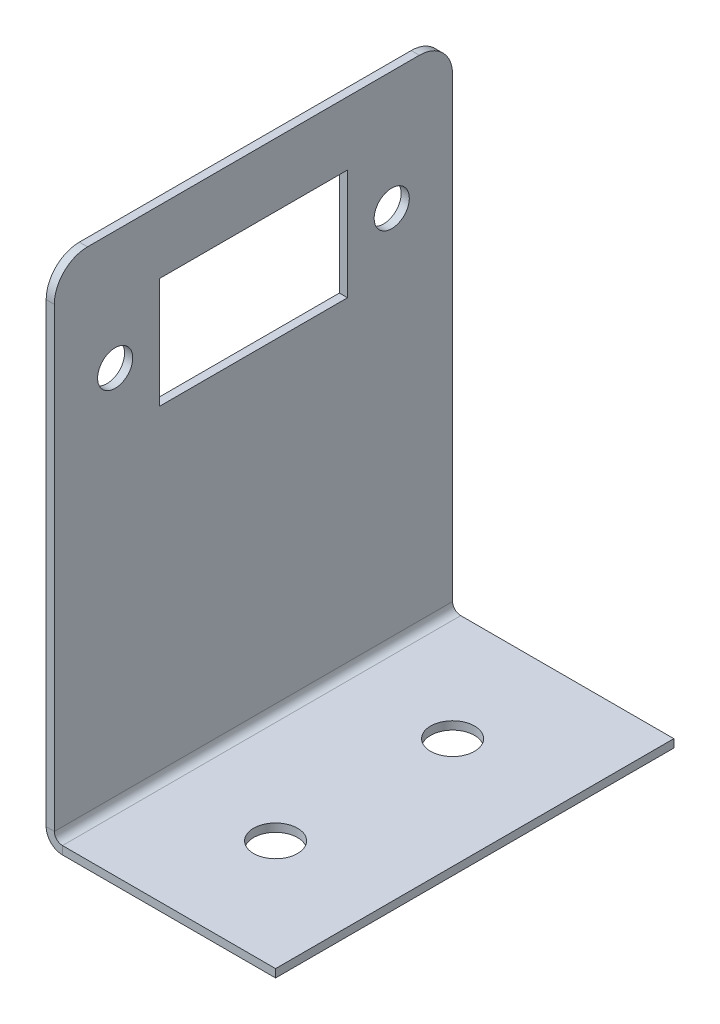
ISO-10303-21;
HEADER;
FILE_DESCRIPTION(('STEP AP214'),'2;1');
FILE_NAME('part.step','',(''),(''),'','','');
FILE_SCHEMA(('AUTOMOTIVE_DESIGN { 1 0 10303 214 1 1 1 1 }'));
ENDSEC;
DATA;
#1=APPLICATION_CONTEXT('core data for automotive mechanical design processes');
#2=APPLICATION_PROTOCOL_DEFINITION('international standard','automotive_design',2000,#1);
#3=PRODUCT_CONTEXT('',#1,'mechanical');
#4=PRODUCT('Part','Part','',(#3));
#5=PRODUCT_RELATED_PRODUCT_CATEGORY('part','',(#4));
#6=PRODUCT_DEFINITION_FORMATION('','',#4);
#7=PRODUCT_DEFINITION_CONTEXT('part definition',#1,'design');
#8=PRODUCT_DEFINITION('design','',#6,#7);
#9=PRODUCT_DEFINITION_SHAPE('','',#8);
#10=(LENGTH_UNIT() NAMED_UNIT(*) SI_UNIT(.MILLI.,.METRE.));
#11=(NAMED_UNIT(*) PLANE_ANGLE_UNIT() SI_UNIT($,.RADIAN.));
#12=(NAMED_UNIT(*) SI_UNIT($,.STERADIAN.) SOLID_ANGLE_UNIT());
#13=UNCERTAINTY_MEASURE_WITH_UNIT(LENGTH_MEASURE(1.E-05),#10,'distance_accuracy_value','');
#14=(GEOMETRIC_REPRESENTATION_CONTEXT(3) GLOBAL_UNCERTAINTY_ASSIGNED_CONTEXT((#13)) GLOBAL_UNIT_ASSIGNED_CONTEXT((#10,
#11,#12)) REPRESENTATION_CONTEXT('',''));
#15=CARTESIAN_POINT('',(0.,0.,0.));
#16=DIRECTION('',(0.,0.,1.));
#17=DIRECTION('',(1.,0.,0.));
#18=AXIS2_PLACEMENT_3D('',#15,#16,#17);
#19=CARTESIAN_POINT('',(0.736600000000004,0.,18.));
#20=DIRECTION('',(0.,0.,1.));
#21=DIRECTION('',(1.,0.,0.));
#22=AXIS2_PLACEMENT_3D('',#19,#20,#21);
#23=PLANE('',#22);
#24=DIRECTION('',(0.,-1.,0.));
#25=VECTOR('',#24,1.);
#26=CARTESIAN_POINT('',(0.736600000000004,0.,18.));
#27=LINE('',#26,#25);
#28=CARTESIAN_POINT('',(0.736600000000004,0.,18.));
#29=VERTEX_POINT('',#28);
#30=CARTESIAN_POINT('',(0.736600000000004,-0.7366,18.));
#31=VERTEX_POINT('',#30);
#32=EDGE_CURVE('E250',#29,#31,#27,.T.);
#33=ORIENTED_EDGE('',*,*,#32,.F.);
#34=CARTESIAN_POINT('',(0.736600000000004,0.736600000000005,18.));
#35=DIRECTION('',(0.,0.,-1.));
#36=DIRECTION('',(-1.,0.,0.));
#37=AXIS2_PLACEMENT_3D('',#34,#35,#36);
#38=CIRCLE('',#37,0.7366);
#39=CARTESIAN_POINT('',(0.,0.736600000000032,18.));
#40=VERTEX_POINT('',#39);
#41=EDGE_CURVE('E195',#40,#29,#38,.F.);
#42=ORIENTED_EDGE('',*,*,#41,.F.);
#43=DIRECTION('',(1.,0.,0.));
#44=VECTOR('',#43,1.);
#45=CARTESIAN_POINT('',(-0.736600000000004,0.736600000000058,18.));
#46=LINE('',#45,#44);
#47=CARTESIAN_POINT('',(-0.736600000000004,0.736600000000058,18.));
#48=VERTEX_POINT('',#47);
#49=EDGE_CURVE('E247',#48,#40,#46,.T.);
#50=ORIENTED_EDGE('',*,*,#49,.F.);
#51=CARTESIAN_POINT('',(0.736600000000004,0.736600000000005,18.));
#52=DIRECTION('',(0.,0.,1.));
#53=DIRECTION('',(1.,0.,0.));
#54=AXIS2_PLACEMENT_3D('',#51,#52,#53);
#55=CIRCLE('',#54,1.4732);
#56=EDGE_CURVE('E202',#48,#31,#55,.T.);
#57=ORIENTED_EDGE('',*,*,#56,.T.);
#58=EDGE_LOOP('',(#33,#42,#50,#57));
#59=FACE_BOUND('',#58,.T.);
#60=ADVANCED_FACE('F36',(#59),#23,.T.);
#61=CARTESIAN_POINT('',(-0.736600000000004,0.736600000000058,18.));
#62=DIRECTION('',(0.,0.,1.));
#63=DIRECTION('',(1.,0.,0.));
#64=AXIS2_PLACEMENT_3D('',#61,#62,#63);
#65=PLANE('',#64);
#66=DIRECTION('',(1.,0.,0.));
#67=VECTOR('',#66,1.);
#68=CARTESIAN_POINT('',(0.,0.,18.));
#69=LINE('',#68,#67);
#70=CARTESIAN_POINT('',(20.,0.,18.));
#71=VERTEX_POINT('',#70);
#72=EDGE_CURVE('E192',#29,#71,#69,.T.);
#73=ORIENTED_EDGE('',*,*,#72,.F.);
#74=ORIENTED_EDGE('',*,*,#32,.T.);
#75=DIRECTION('',(1.,0.,0.));
#76=VECTOR('',#75,1.);
#77=CARTESIAN_POINT('',(0.,-0.7366,18.));
#78=LINE('',#77,#76);
#79=CARTESIAN_POINT('',(20.,-0.7366,18.));
#80=VERTEX_POINT('',#79);
#81=EDGE_CURVE('E186',#31,#80,#78,.T.);
#82=ORIENTED_EDGE('',*,*,#81,.T.);
#83=DIRECTION('',(0.,-1.,0.));
#84=VECTOR('',#83,1.);
#85=CARTESIAN_POINT('',(20.,0.,18.));
#86=LINE('',#85,#84);
#87=EDGE_CURVE('E188',#71,#80,#86,.T.);
#88=ORIENTED_EDGE('',*,*,#87,.F.);
#89=EDGE_LOOP('',(#73,#74,#82,#88));
#90=FACE_BOUND('',#89,.T.);
#91=ADVANCED_FACE('F298',(#90),#65,.T.);
#92=CARTESIAN_POINT('',(0.,0.736600000000032,-18.));
#93=DIRECTION('',(0.,0.,-1.));
#94=DIRECTION('',(-1.,0.,0.));
#95=AXIS2_PLACEMENT_3D('',#92,#93,#94);
#96=PLANE('',#95);
#97=DIRECTION('',(-1.,0.,0.));
#98=VECTOR('',#97,1.);
#99=CARTESIAN_POINT('',(0.,0.736600000000032,-18.));
#100=LINE('',#99,#98);
#101=CARTESIAN_POINT('',(0.,0.736600000000032,-18.));
#102=VERTEX_POINT('',#101);
#103=CARTESIAN_POINT('',(-0.736600000000004,0.736600000000058,-18.));
#104=VERTEX_POINT('',#103);
#105=EDGE_CURVE('E244',#102,#104,#100,.T.);
#106=ORIENTED_EDGE('',*,*,#105,.F.);
#107=CARTESIAN_POINT('',(0.736600000000004,0.736600000000005,-18.));
#108=DIRECTION('',(0.,0.,-1.));
#109=DIRECTION('',(-1.,0.,0.));
#110=AXIS2_PLACEMENT_3D('',#107,#108,#109);
#111=CIRCLE('',#110,0.7366);
#112=CARTESIAN_POINT('',(0.736600000000004,0.,-18.));
#113=VERTEX_POINT('',#112);
#114=EDGE_CURVE('E214',#102,#113,#111,.F.);
#115=ORIENTED_EDGE('',*,*,#114,.T.);
#116=DIRECTION('',(0.,1.,0.));
#117=VECTOR('',#116,1.);
#118=CARTESIAN_POINT('',(0.736600000000004,-0.7366,-18.));
#119=LINE('',#118,#117);
#120=CARTESIAN_POINT('',(0.736600000000004,-0.7366,-18.));
#121=VERTEX_POINT('',#120);
#122=EDGE_CURVE('E242',#121,#113,#119,.T.);
#123=ORIENTED_EDGE('',*,*,#122,.F.);
#124=CARTESIAN_POINT('',(0.736600000000004,0.736600000000005,-18.));
#125=DIRECTION('',(0.,0.,1.));
#126=DIRECTION('',(1.,0.,0.));
#127=AXIS2_PLACEMENT_3D('',#124,#125,#126);
#128=CIRCLE('',#127,1.4732);
#129=EDGE_CURVE('E189',#104,#121,#128,.T.);
#130=ORIENTED_EDGE('',*,*,#129,.F.);
#131=EDGE_LOOP('',(#106,#115,#123,#130));
#132=FACE_BOUND('',#131,.T.);
#133=ADVANCED_FACE('F309',(#132),#96,.T.);
#134=CARTESIAN_POINT('',(0.736600000000004,-0.7366,-18.));
#135=DIRECTION('',(0.,0.,-1.));
#136=DIRECTION('',(-1.,0.,0.));
#137=AXIS2_PLACEMENT_3D('',#134,#135,#136);
#138=PLANE('',#137);
#139=DIRECTION('',(0.,-1.,0.));
#140=VECTOR('',#139,1.);
#141=CARTESIAN_POINT('',(-0.73659999999999,45.,-18.));
#142=LINE('',#141,#140);
#143=CARTESIAN_POINT('',(-0.73659999999999,42.,-18.));
#144=VERTEX_POINT('',#143);
#145=EDGE_CURVE('E219',#144,#104,#142,.T.);
#146=ORIENTED_EDGE('',*,*,#145,.F.);
#147=DIRECTION('',(1.,0.,0.));
#148=VECTOR('',#147,1.);
#149=CARTESIAN_POINT('',(0.736600000000004,42.,-18.));
#150=LINE('',#149,#148);
#151=CARTESIAN_POINT('',(0.,42.,-18.));
#152=VERTEX_POINT('',#151);
#153=EDGE_CURVE('E252',#144,#152,#150,.T.);
#154=ORIENTED_EDGE('',*,*,#153,.T.);
#155=DIRECTION('',(0.,-1.,0.));
#156=VECTOR('',#155,1.);
#157=CARTESIAN_POINT('',(0.,45.,-18.));
#158=LINE('',#157,#156);
#159=EDGE_CURVE('E217',#152,#102,#158,.T.);
#160=ORIENTED_EDGE('',*,*,#159,.T.);
#161=ORIENTED_EDGE('',*,*,#105,.T.);
#162=EDGE_LOOP('',(#146,#154,#160,#161));
#163=FACE_BOUND('',#162,.T.);
#164=ADVANCED_FACE('F270',(#163),#138,.T.);
#165=CARTESIAN_POINT('',(0.,-0.7366,18.));
#166=DIRECTION('',(0.,1.,0.));
#167=DIRECTION('',(0.,0.,1.));
#168=AXIS2_PLACEMENT_3D('',#165,#166,#167);
#169=PLANE('',#168);
#170=CARTESIAN_POINT('',(9.99999999999999,-0.7366,8.));
#171=DIRECTION('',(0.,1.,0.));
#172=DIRECTION('',(0.,0.,1.));
#173=AXIS2_PLACEMENT_3D('',#170,#171,#172);
#174=CIRCLE('',#173,1.984375);
#175=CARTESIAN_POINT('',(9.99999999999999,-0.7366,9.984375));
#176=VERTEX_POINT('',#175);
#177=EDGE_CURVE('E398',#176,#176,#174,.T.);
#178=ORIENTED_EDGE('',*,*,#177,.T.);
#179=EDGE_LOOP('',(#178));
#180=FACE_BOUND('',#179,.T.);
#181=CARTESIAN_POINT('',(9.99999999999999,-0.7366,-8.));
#182=DIRECTION('',(0.,1.,0.));
#183=DIRECTION('',(0.,0.,1.));
#184=AXIS2_PLACEMENT_3D('',#181,#182,#183);
#185=CIRCLE('',#184,1.984375);
#186=CARTESIAN_POINT('',(9.99999999999999,-0.7366,-6.015625));
#187=VERTEX_POINT('',#186);
#188=EDGE_CURVE('E397',#187,#187,#185,.T.);
#189=ORIENTED_EDGE('',*,*,#188,.T.);
#190=EDGE_LOOP('',(#189));
#191=FACE_BOUND('',#190,.T.);
#192=DIRECTION('',(1.,0.,0.));
#193=VECTOR('',#192,1.);
#194=CARTESIAN_POINT('',(0.,-0.7366,-18.));
#195=LINE('',#194,#193);
#196=CARTESIAN_POINT('',(20.,-0.7366,-18.));
#197=VERTEX_POINT('',#196);
#198=EDGE_CURVE('E182',#121,#197,#195,.T.);
#199=ORIENTED_EDGE('',*,*,#198,.T.);
#200=DIRECTION('',(0.,0.,-1.));
#201=VECTOR('',#200,1.);
#202=CARTESIAN_POINT('',(20.,-0.7366,18.));
#203=LINE('',#202,#201);
#204=EDGE_CURVE('E240',#80,#197,#203,.T.);
#205=ORIENTED_EDGE('',*,*,#204,.F.);
#206=ORIENTED_EDGE('',*,*,#81,.F.);
#207=DIRECTION('',(0.,0.,-1.));
#208=VECTOR('',#207,1.);
#209=CARTESIAN_POINT('',(0.736600000000004,-0.7366,18.));
#210=LINE('',#209,#208);
#211=EDGE_CURVE('E205',#31,#121,#210,.T.);
#212=ORIENTED_EDGE('',*,*,#211,.T.);
#213=EDGE_LOOP('',(#199,#205,#206,#212));
#214=FACE_BOUND('',#213,.T.);
#215=ADVANCED_FACE('F313',(#180,#191,#214),#169,.F.);
#216=CARTESIAN_POINT('',(20.,0.,18.));
#217=DIRECTION('',(1.,0.,0.));
#218=DIRECTION('',(0.,0.,-1.));
#219=AXIS2_PLACEMENT_3D('',#216,#217,#218);
#220=PLANE('',#219);
#221=DIRECTION('',(0.,-1.,0.));
#222=VECTOR('',#221,1.);
#223=CARTESIAN_POINT('',(20.,0.,-18.));
#224=LINE('',#223,#222);
#225=CARTESIAN_POINT('',(20.,0.,-18.));
#226=VERTEX_POINT('',#225);
#227=EDGE_CURVE('E208',#226,#197,#224,.T.);
#228=ORIENTED_EDGE('',*,*,#227,.F.);
#229=DIRECTION('',(0.,0.,-1.));
#230=VECTOR('',#229,1.);
#231=CARTESIAN_POINT('',(20.,0.,18.));
#232=LINE('',#231,#230);
#233=EDGE_CURVE('E238',#71,#226,#232,.T.);
#234=ORIENTED_EDGE('',*,*,#233,.F.);
#235=ORIENTED_EDGE('',*,*,#87,.T.);
#236=ORIENTED_EDGE('',*,*,#204,.T.);
#237=EDGE_LOOP('',(#228,#234,#235,#236));
#238=FACE_BOUND('',#237,.T.);
#239=ADVANCED_FACE('F303',(#238),#220,.T.);
#240=CARTESIAN_POINT('',(0.,0.,18.));
#241=DIRECTION('',(0.,1.,0.));
#242=DIRECTION('',(0.,0.,1.));
#243=AXIS2_PLACEMENT_3D('',#240,#241,#242);
#244=PLANE('',#243);
#245=CARTESIAN_POINT('',(9.99999999999999,0.,8.));
#246=DIRECTION('',(0.,1.,0.));
#247=DIRECTION('',(0.,0.,1.));
#248=AXIS2_PLACEMENT_3D('',#245,#246,#247);
#249=CIRCLE('',#248,1.984375);
#250=CARTESIAN_POINT('',(9.99999999999999,0.,9.984375));
#251=VERTEX_POINT('',#250);
#252=EDGE_CURVE('E392',#251,#251,#249,.T.);
#253=ORIENTED_EDGE('',*,*,#252,.F.);
#254=EDGE_LOOP('',(#253));
#255=FACE_BOUND('',#254,.T.);
#256=CARTESIAN_POINT('',(9.99999999999999,0.,-8.));
#257=DIRECTION('',(0.,1.,0.));
#258=DIRECTION('',(0.,0.,1.));
#259=AXIS2_PLACEMENT_3D('',#256,#257,#258);
#260=CIRCLE('',#259,1.984375);
#261=CARTESIAN_POINT('',(9.99999999999999,0.,-6.015625));
#262=VERTEX_POINT('',#261);
#263=EDGE_CURVE('E395',#262,#262,#260,.T.);
#264=ORIENTED_EDGE('',*,*,#263,.F.);
#265=EDGE_LOOP('',(#264));
#266=FACE_BOUND('',#265,.T.);
#267=DIRECTION('',(1.,0.,0.));
#268=VECTOR('',#267,1.);
#269=CARTESIAN_POINT('',(0.,0.,-18.));
#270=LINE('',#269,#268);
#271=EDGE_CURVE('E211',#113,#226,#270,.T.);
#272=ORIENTED_EDGE('',*,*,#271,.F.);
#273=DIRECTION('',(0.,0.,-1.));
#274=VECTOR('',#273,1.);
#275=CARTESIAN_POINT('',(0.736600000000004,0.,18.));
#276=LINE('',#275,#274);
#277=EDGE_CURVE('E235',#29,#113,#276,.T.);
#278=ORIENTED_EDGE('',*,*,#277,.F.);
#279=ORIENTED_EDGE('',*,*,#72,.T.);
#280=ORIENTED_EDGE('',*,*,#233,.T.);
#281=EDGE_LOOP('',(#272,#278,#279,#280));
#282=FACE_BOUND('',#281,.T.);
#283=ADVANCED_FACE('F296',(#255,#266,#282),#244,.T.);
#284=CARTESIAN_POINT('',(0.736600000000004,0.736600000000005,18.));
#285=DIRECTION('',(0.,0.,-1.));
#286=DIRECTION('',(-1.,0.,0.));
#287=AXIS2_PLACEMENT_3D('',#284,#285,#286);
#288=CYLINDRICAL_SURFACE('',#287,0.7366);
#289=ORIENTED_EDGE('',*,*,#114,.F.);
#290=DIRECTION('',(0.,0.,-1.));
#291=VECTOR('',#290,1.);
#292=CARTESIAN_POINT('',(0.,0.736600000000032,18.));
#293=LINE('',#292,#291);
#294=EDGE_CURVE('E232',#40,#102,#293,.T.);
#295=ORIENTED_EDGE('',*,*,#294,.F.);
#296=ORIENTED_EDGE('',*,*,#41,.T.);
#297=ORIENTED_EDGE('',*,*,#277,.T.);
#298=EDGE_LOOP('',(#289,#295,#296,#297));
#299=FACE_BOUND('',#298,.T.);
#300=ADVANCED_FACE('F288',(#299),#288,.F.);
#301=CARTESIAN_POINT('',(0.,45.,18.));
#302=DIRECTION('',(1.,0.,0.));
#303=DIRECTION('',(0.,1.,0.));
#304=AXIS2_PLACEMENT_3D('',#301,#302,#303);
#305=PLANE('',#304);
#306=CARTESIAN_POINT('',(0.,34.2634,-12.5));
#307=DIRECTION('',(1.,0.,0.));
#308=DIRECTION('',(0.,1.,0.));
#309=AXIS2_PLACEMENT_3D('',#306,#307,#308);
#310=CIRCLE('',#309,1.5875);
#311=CARTESIAN_POINT('',(0.,35.8509,-12.5));
#312=VERTEX_POINT('',#311);
#313=EDGE_CURVE('E401',#312,#312,#310,.T.);
#314=ORIENTED_EDGE('',*,*,#313,.F.);
#315=EDGE_LOOP('',(#314));
#316=FACE_BOUND('',#315,.T.);
#317=CARTESIAN_POINT('',(0.,34.2634,12.5));
#318=DIRECTION('',(1.,0.,0.));
#319=DIRECTION('',(0.,1.,0.));
#320=AXIS2_PLACEMENT_3D('',#317,#318,#319);
#321=CIRCLE('',#320,1.5875);
#322=CARTESIAN_POINT('',(0.,35.8509,12.5));
#323=VERTEX_POINT('',#322);
#324=EDGE_CURVE('E169',#323,#323,#321,.T.);
#325=ORIENTED_EDGE('',*,*,#324,.F.);
#326=EDGE_LOOP('',(#325));
#327=FACE_BOUND('',#326,.T.);
#328=DIRECTION('',(0.,-1.,0.));
#329=VECTOR('',#328,1.);
#330=CARTESIAN_POINT('',(0.,39.2634,8.5));
#331=LINE('',#330,#329);
#332=CARTESIAN_POINT('',(0.,39.2634,8.5));
#333=VERTEX_POINT('',#332);
#334=CARTESIAN_POINT('',(0.,29.2634,8.5));
#335=VERTEX_POINT('',#334);
#336=EDGE_CURVE('E145',#333,#335,#331,.T.);
#337=ORIENTED_EDGE('',*,*,#336,.F.);
#338=DIRECTION('',(0.,0.,1.));
#339=VECTOR('',#338,1.);
#340=CARTESIAN_POINT('',(0.,39.2634,8.5));
#341=LINE('',#340,#339);
#342=CARTESIAN_POINT('',(0.,39.2634,-8.5));
#343=VERTEX_POINT('',#342);
#344=EDGE_CURVE('E163',#343,#333,#341,.T.);
#345=ORIENTED_EDGE('',*,*,#344,.F.);
#346=DIRECTION('',(0.,1.,0.));
#347=VECTOR('',#346,1.);
#348=CARTESIAN_POINT('',(0.,39.2634,-8.5));
#349=LINE('',#348,#347);
#350=CARTESIAN_POINT('',(0.,29.2634,-8.5));
#351=VERTEX_POINT('',#350);
#352=EDGE_CURVE('E166',#351,#343,#349,.T.);
#353=ORIENTED_EDGE('',*,*,#352,.F.);
#354=DIRECTION('',(0.,0.,-1.));
#355=VECTOR('',#354,1.);
#356=CARTESIAN_POINT('',(0.,29.2634,8.5));
#357=LINE('',#356,#355);
#358=EDGE_CURVE('E175',#335,#351,#357,.T.);
#359=ORIENTED_EDGE('',*,*,#358,.F.);
#360=EDGE_LOOP('',(#337,#345,#353,#359));
#361=FACE_BOUND('',#360,.T.);
#362=ORIENTED_EDGE('',*,*,#159,.F.);
#363=CARTESIAN_POINT('',(0.,42.,-15.));
#364=DIRECTION('',(1.,0.,0.));
#365=DIRECTION('',(0.,1.,0.));
#366=AXIS2_PLACEMENT_3D('',#363,#364,#365);
#367=CIRCLE('',#366,3.);
#368=CARTESIAN_POINT('',(0.,45.,-15.));
#369=VERTEX_POINT('',#368);
#370=EDGE_CURVE('E257',#152,#369,#367,.T.);
#371=ORIENTED_EDGE('',*,*,#370,.T.);
#372=DIRECTION('',(0.,0.,-1.));
#373=VECTOR('',#372,1.);
#374=CARTESIAN_POINT('',(0.,45.,18.));
#375=LINE('',#374,#373);
#376=CARTESIAN_POINT('',(0.,45.,15.));
#377=VERTEX_POINT('',#376);
#378=EDGE_CURVE('E230',#377,#369,#375,.T.);
#379=ORIENTED_EDGE('',*,*,#378,.F.);
#380=CARTESIAN_POINT('',(0.,42.,15.));
#381=DIRECTION('',(1.,0.,0.));
#382=DIRECTION('',(0.,1.,0.));
#383=AXIS2_PLACEMENT_3D('',#380,#381,#382);
#384=CIRCLE('',#383,3.);
#385=CARTESIAN_POINT('',(0.,42.,18.));
#386=VERTEX_POINT('',#385);
#387=EDGE_CURVE('E255',#377,#386,#384,.T.);
#388=ORIENTED_EDGE('',*,*,#387,.T.);
#389=DIRECTION('',(0.,-1.,0.));
#390=VECTOR('',#389,1.);
#391=CARTESIAN_POINT('',(0.,45.,18.));
#392=LINE('',#391,#390);
#393=EDGE_CURVE('E198',#386,#40,#392,.T.);
#394=ORIENTED_EDGE('',*,*,#393,.T.);
#395=ORIENTED_EDGE('',*,*,#294,.T.);
#396=EDGE_LOOP('',(#362,#371,#379,#388,#394,#395));
#397=FACE_BOUND('',#396,.T.);
#398=ADVANCED_FACE('F276',(#316,#327,#361,#397),#305,.T.);
#399=CARTESIAN_POINT('',(-0.73659999999999,45.,18.));
#400=DIRECTION('',(0.,1.,0.));
#401=DIRECTION('',(0.,0.,1.));
#402=AXIS2_PLACEMENT_3D('',#399,#400,#401);
#403=PLANE('',#402);
#404=ORIENTED_EDGE('',*,*,#378,.T.);
#405=DIRECTION('',(1.,0.,0.));
#406=VECTOR('',#405,1.);
#407=CARTESIAN_POINT('',(-0.73659999999999,45.,-15.));
#408=LINE('',#407,#406);
#409=CARTESIAN_POINT('',(-0.73659999999999,45.,-15.));
#410=VERTEX_POINT('',#409);
#411=EDGE_CURVE('E57',#369,#410,#408,.F.);
#412=ORIENTED_EDGE('',*,*,#411,.T.);
#413=DIRECTION('',(0.,0.,-1.));
#414=VECTOR('',#413,1.);
#415=CARTESIAN_POINT('',(-0.73659999999999,45.,18.));
#416=LINE('',#415,#414);
#417=CARTESIAN_POINT('',(-0.73659999999999,45.,15.));
#418=VERTEX_POINT('',#417);
#419=EDGE_CURVE('E228',#418,#410,#416,.T.);
#420=ORIENTED_EDGE('',*,*,#419,.F.);
#421=DIRECTION('',(1.,0.,0.));
#422=VECTOR('',#421,1.);
#423=CARTESIAN_POINT('',(0.,45.,15.));
#424=LINE('',#423,#422);
#425=EDGE_CURVE('E259',#418,#377,#424,.T.);
#426=ORIENTED_EDGE('',*,*,#425,.T.);
#427=EDGE_LOOP('',(#404,#412,#420,#426));
#428=FACE_BOUND('',#427,.T.);
#429=ADVANCED_FACE('F277',(#428),#403,.T.);
#430=CARTESIAN_POINT('',(-0.73659999999999,45.,18.));
#431=DIRECTION('',(1.,0.,0.));
#432=DIRECTION('',(0.,1.,0.));
#433=AXIS2_PLACEMENT_3D('',#430,#431,#432);
#434=PLANE('',#433);
#435=CARTESIAN_POINT('',(-0.736600000000004,34.2634,-12.5));
#436=DIRECTION('',(1.,0.,0.));
#437=DIRECTION('',(0.,1.,0.));
#438=AXIS2_PLACEMENT_3D('',#435,#436,#437);
#439=CIRCLE('',#438,1.5875);
#440=CARTESIAN_POINT('',(-0.736600000000003,35.8509,-12.5));
#441=VERTEX_POINT('',#440);
#442=EDGE_CURVE('E406',#441,#441,#439,.T.);
#443=ORIENTED_EDGE('',*,*,#442,.T.);
#444=EDGE_LOOP('',(#443));
#445=FACE_BOUND('',#444,.T.);
#446=CARTESIAN_POINT('',(-0.736600000000004,34.2634,12.5));
#447=DIRECTION('',(1.,0.,0.));
#448=DIRECTION('',(0.,1.,0.));
#449=AXIS2_PLACEMENT_3D('',#446,#447,#448);
#450=CIRCLE('',#449,1.5875);
#451=CARTESIAN_POINT('',(-0.736600000000003,35.8509,12.5));
#452=VERTEX_POINT('',#451);
#453=EDGE_CURVE('E176',#452,#452,#450,.T.);
#454=ORIENTED_EDGE('',*,*,#453,.T.);
#455=EDGE_LOOP('',(#454));
#456=FACE_BOUND('',#455,.T.);
#457=DIRECTION('',(0.,0.,1.));
#458=VECTOR('',#457,1.);
#459=CARTESIAN_POINT('',(-0.736600000000004,39.2634,8.5));
#460=LINE('',#459,#458);
#461=CARTESIAN_POINT('',(-0.736600000000004,39.2634,-8.5));
#462=VERTEX_POINT('',#461);
#463=CARTESIAN_POINT('',(-0.736600000000004,39.2634,8.5));
#464=VERTEX_POINT('',#463);
#465=EDGE_CURVE('E150',#462,#464,#460,.T.);
#466=ORIENTED_EDGE('',*,*,#465,.T.);
#467=DIRECTION('',(0.,-1.,0.));
#468=VECTOR('',#467,1.);
#469=CARTESIAN_POINT('',(-0.736600000000004,39.2634,8.5));
#470=LINE('',#469,#468);
#471=CARTESIAN_POINT('',(-0.736600000000004,29.2634,8.5));
#472=VERTEX_POINT('',#471);
#473=EDGE_CURVE('E142',#464,#472,#470,.T.);
#474=ORIENTED_EDGE('',*,*,#473,.T.);
#475=DIRECTION('',(0.,0.,-1.));
#476=VECTOR('',#475,1.);
#477=CARTESIAN_POINT('',(-0.736600000000004,29.2634,8.5));
#478=LINE('',#477,#476);
#479=CARTESIAN_POINT('',(-0.73659999999999,29.2634,-8.5));
#480=VERTEX_POINT('',#479);
#481=EDGE_CURVE('E154',#472,#480,#478,.T.);
#482=ORIENTED_EDGE('',*,*,#481,.T.);
#483=DIRECTION('',(0.,1.,0.));
#484=VECTOR('',#483,1.);
#485=CARTESIAN_POINT('',(-0.736600000000004,39.2634,-8.5));
#486=LINE('',#485,#484);
#487=EDGE_CURVE('E158',#480,#462,#486,.T.);
#488=ORIENTED_EDGE('',*,*,#487,.T.);
#489=EDGE_LOOP('',(#466,#474,#482,#488));
#490=FACE_BOUND('',#489,.T.);
#491=ORIENTED_EDGE('',*,*,#419,.T.);
#492=CARTESIAN_POINT('',(-0.73659999999999,42.,-15.));
#493=DIRECTION('',(1.,0.,0.));
#494=DIRECTION('',(0.,1.,0.));
#495=AXIS2_PLACEMENT_3D('',#492,#493,#494);
#496=CIRCLE('',#495,3.);
#497=EDGE_CURVE('E44',#410,#144,#496,.F.);
#498=ORIENTED_EDGE('',*,*,#497,.T.);
#499=ORIENTED_EDGE('',*,*,#145,.T.);
#500=DIRECTION('',(0.,0.,-1.));
#501=VECTOR('',#500,1.);
#502=CARTESIAN_POINT('',(-0.736600000000004,0.736600000000058,18.));
#503=LINE('',#502,#501);
#504=EDGE_CURVE('E225',#48,#104,#503,.T.);
#505=ORIENTED_EDGE('',*,*,#504,.F.);
#506=DIRECTION('',(0.,-1.,0.));
#507=VECTOR('',#506,1.);
#508=CARTESIAN_POINT('',(-0.73659999999999,45.,18.));
#509=LINE('',#508,#507);
#510=CARTESIAN_POINT('',(-0.73659999999999,42.,18.));
#511=VERTEX_POINT('',#510);
#512=EDGE_CURVE('E200',#511,#48,#509,.T.);
#513=ORIENTED_EDGE('',*,*,#512,.F.);
#514=CARTESIAN_POINT('',(-0.73659999999999,42.,15.));
#515=DIRECTION('',(1.,0.,0.));
#516=DIRECTION('',(0.,1.,0.));
#517=AXIS2_PLACEMENT_3D('',#514,#515,#516);
#518=CIRCLE('',#517,3.);
#519=EDGE_CURVE('E263',#511,#418,#518,.F.);
#520=ORIENTED_EDGE('',*,*,#519,.T.);
#521=EDGE_LOOP('',(#491,#498,#499,#505,#513,#520));
#522=FACE_BOUND('',#521,.T.);
#523=ADVANCED_FACE('F160',(#445,#456,#490,#522),#434,.F.);
#524=CARTESIAN_POINT('',(0.736600000000004,0.736600000000005,18.));
#525=DIRECTION('',(0.,0.,-1.));
#526=DIRECTION('',(-1.,0.,0.));
#527=AXIS2_PLACEMENT_3D('',#524,#525,#526);
#528=CYLINDRICAL_SURFACE('',#527,1.4732);
#529=ORIENTED_EDGE('',*,*,#129,.T.);
#530=ORIENTED_EDGE('',*,*,#211,.F.);
#531=ORIENTED_EDGE('',*,*,#56,.F.);
#532=ORIENTED_EDGE('',*,*,#504,.T.);
#533=EDGE_LOOP('',(#529,#530,#531,#532));
#534=FACE_BOUND('',#533,.T.);
#535=ADVANCED_FACE('F311',(#534),#528,.T.);
#536=CARTESIAN_POINT('',(0.736600000000004,0.736600000000005,18.));
#537=DIRECTION('',(0.,0.,-1.));
#538=DIRECTION('',(-1.,0.,0.));
#539=AXIS2_PLACEMENT_3D('',#536,#537,#538);
#540=PLANE('',#539);
#541=ORIENTED_EDGE('',*,*,#393,.F.);
#542=DIRECTION('',(1.,0.,0.));
#543=VECTOR('',#542,1.);
#544=CARTESIAN_POINT('',(-0.73659999999999,42.,18.));
#545=LINE('',#544,#543);
#546=EDGE_CURVE('E11',#386,#511,#545,.F.);
#547=ORIENTED_EDGE('',*,*,#546,.T.);
#548=ORIENTED_EDGE('',*,*,#512,.T.);
#549=ORIENTED_EDGE('',*,*,#49,.T.);
#550=EDGE_LOOP('',(#541,#547,#548,#549));
#551=FACE_BOUND('',#550,.T.);
#552=ADVANCED_FACE('F281',(#551),#540,.F.);
#553=CARTESIAN_POINT('',(0.736600000000004,0.736600000000005,-18.));
#554=DIRECTION('',(0.,0.,-1.));
#555=DIRECTION('',(-1.,0.,0.));
#556=AXIS2_PLACEMENT_3D('',#553,#554,#555);
#557=PLANE('',#556);
#558=ORIENTED_EDGE('',*,*,#198,.F.);
#559=ORIENTED_EDGE('',*,*,#122,.T.);
#560=ORIENTED_EDGE('',*,*,#271,.T.);
#561=ORIENTED_EDGE('',*,*,#227,.T.);
#562=EDGE_LOOP('',(#558,#559,#560,#561));
#563=FACE_BOUND('',#562,.T.);
#564=ADVANCED_FACE('F306',(#563),#557,.T.);
#565=CARTESIAN_POINT('',(-0.736600000000004,39.2634,8.5));
#566=DIRECTION('',(0.,0.,1.));
#567=DIRECTION('',(0.,-1.,0.));
#568=AXIS2_PLACEMENT_3D('',#565,#566,#567);
#569=PLANE('',#568);
#570=ORIENTED_EDGE('',*,*,#336,.T.);
#571=DIRECTION('',(1.,0.,0.));
#572=VECTOR('',#571,1.);
#573=CARTESIAN_POINT('',(-0.736600000000004,29.2634,8.5));
#574=LINE('',#573,#572);
#575=EDGE_CURVE('E138',#472,#335,#574,.T.);
#576=ORIENTED_EDGE('',*,*,#575,.F.);
#577=ORIENTED_EDGE('',*,*,#473,.F.);
#578=DIRECTION('',(1.,0.,0.));
#579=VECTOR('',#578,1.);
#580=CARTESIAN_POINT('',(-0.736600000000004,39.2634,8.5));
#581=LINE('',#580,#579);
#582=EDGE_CURVE('E180',#464,#333,#581,.T.);
#583=ORIENTED_EDGE('',*,*,#582,.T.);
#584=EDGE_LOOP('',(#570,#576,#577,#583));
#585=FACE_BOUND('',#584,.T.);
#586=ADVANCED_FACE('F140',(#585),#569,.F.);
#587=CARTESIAN_POINT('',(-0.736600000000004,39.2634,8.5));
#588=DIRECTION('',(0.,1.,0.));
#589=DIRECTION('',(-1.,0.,0.));
#590=AXIS2_PLACEMENT_3D('',#587,#588,#589);
#591=PLANE('',#590);
#592=ORIENTED_EDGE('',*,*,#344,.T.);
#593=ORIENTED_EDGE('',*,*,#582,.F.);
#594=ORIENTED_EDGE('',*,*,#465,.F.);
#595=DIRECTION('',(1.,0.,0.));
#596=VECTOR('',#595,1.);
#597=CARTESIAN_POINT('',(-0.736600000000004,39.2634,-8.5));
#598=LINE('',#597,#596);
#599=EDGE_CURVE('E183',#462,#343,#598,.T.);
#600=ORIENTED_EDGE('',*,*,#599,.T.);
#601=EDGE_LOOP('',(#592,#593,#594,#600));
#602=FACE_BOUND('',#601,.T.);
#603=ADVANCED_FACE('F357',(#602),#591,.F.);
#604=CARTESIAN_POINT('',(-0.736600000000004,39.2634,-8.5));
#605=DIRECTION('',(0.,0.,-1.));
#606=DIRECTION('',(0.,1.,0.));
#607=AXIS2_PLACEMENT_3D('',#604,#605,#606);
#608=PLANE('',#607);
#609=ORIENTED_EDGE('',*,*,#352,.T.);
#610=ORIENTED_EDGE('',*,*,#599,.F.);
#611=ORIENTED_EDGE('',*,*,#487,.F.);
#612=DIRECTION('',(1.,0.,0.));
#613=VECTOR('',#612,1.);
#614=CARTESIAN_POINT('',(-0.736600000000004,29.2634,-8.5));
#615=LINE('',#614,#613);
#616=EDGE_CURVE('E149',#480,#351,#615,.T.);
#617=ORIENTED_EDGE('',*,*,#616,.T.);
#618=EDGE_LOOP('',(#609,#610,#611,#617));
#619=FACE_BOUND('',#618,.T.);
#620=ADVANCED_FACE('F360',(#619),#608,.F.);
#621=CARTESIAN_POINT('',(-0.736600000000004,29.2634,8.5));
#622=DIRECTION('',(0.,-1.,0.));
#623=DIRECTION('',(0.,0.,-1.));
#624=AXIS2_PLACEMENT_3D('',#621,#622,#623);
#625=PLANE('',#624);
#626=ORIENTED_EDGE('',*,*,#358,.T.);
#627=ORIENTED_EDGE('',*,*,#616,.F.);
#628=ORIENTED_EDGE('',*,*,#481,.F.);
#629=ORIENTED_EDGE('',*,*,#575,.T.);
#630=EDGE_LOOP('',(#626,#627,#628,#629));
#631=FACE_BOUND('',#630,.T.);
#632=ADVANCED_FACE('F155',(#631),#625,.F.);
#633=CARTESIAN_POINT('',(-0.736600000000004,34.2634,12.5));
#634=DIRECTION('',(1.,0.,0.));
#635=DIRECTION('',(0.,1.,0.));
#636=AXIS2_PLACEMENT_3D('',#633,#634,#635);
#637=CYLINDRICAL_SURFACE('',#636,1.5875);
#638=ORIENTED_EDGE('',*,*,#453,.F.);
#639=EDGE_LOOP('',(#638));
#640=FACE_BOUND('',#639,.T.);
#641=ORIENTED_EDGE('',*,*,#324,.T.);
#642=EDGE_LOOP('',(#641));
#643=FACE_BOUND('',#642,.T.);
#644=ADVANCED_FACE('F352',(#640,#643),#637,.F.);
#645=CARTESIAN_POINT('',(-0.736600000000004,34.2634,-12.5));
#646=DIRECTION('',(1.,0.,0.));
#647=DIRECTION('',(0.,1.,0.));
#648=AXIS2_PLACEMENT_3D('',#645,#646,#647);
#649=CYLINDRICAL_SURFACE('',#648,1.5875);
#650=ORIENTED_EDGE('',*,*,#442,.F.);
#651=EDGE_LOOP('',(#650));
#652=FACE_BOUND('',#651,.T.);
#653=ORIENTED_EDGE('',*,*,#313,.T.);
#654=EDGE_LOOP('',(#653));
#655=FACE_BOUND('',#654,.T.);
#656=ADVANCED_FACE('F344',(#652,#655),#649,.F.);
#657=CARTESIAN_POINT('',(9.99999999999999,-0.7366,-8.));
#658=DIRECTION('',(0.,1.,0.));
#659=DIRECTION('',(0.,0.,1.));
#660=AXIS2_PLACEMENT_3D('',#657,#658,#659);
#661=CYLINDRICAL_SURFACE('',#660,1.984375);
#662=ORIENTED_EDGE('',*,*,#188,.F.);
#663=EDGE_LOOP('',(#662));
#664=FACE_BOUND('',#663,.T.);
#665=ORIENTED_EDGE('',*,*,#263,.T.);
#666=EDGE_LOOP('',(#665));
#667=FACE_BOUND('',#666,.T.);
#668=ADVANCED_FACE('F338',(#664,#667),#661,.F.);
#669=CARTESIAN_POINT('',(9.99999999999999,-0.7366,8.));
#670=DIRECTION('',(0.,1.,0.));
#671=DIRECTION('',(0.,0.,1.));
#672=AXIS2_PLACEMENT_3D('',#669,#670,#671);
#673=CYLINDRICAL_SURFACE('',#672,1.984375);
#674=ORIENTED_EDGE('',*,*,#177,.F.);
#675=EDGE_LOOP('',(#674));
#676=FACE_BOUND('',#675,.T.);
#677=ORIENTED_EDGE('',*,*,#252,.T.);
#678=EDGE_LOOP('',(#677));
#679=FACE_BOUND('',#678,.T.);
#680=ADVANCED_FACE('F333',(#676,#679),#673,.F.);
#681=CARTESIAN_POINT('',(0.736600000000004,42.,-15.));
#682=DIRECTION('',(1.,0.,0.));
#683=DIRECTION('',(0.,0.,-1.));
#684=AXIS2_PLACEMENT_3D('',#681,#682,#683);
#685=CYLINDRICAL_SURFACE('',#684,3.);
#686=ORIENTED_EDGE('',*,*,#497,.F.);
#687=ORIENTED_EDGE('',*,*,#411,.F.);
#688=ORIENTED_EDGE('',*,*,#370,.F.);
#689=ORIENTED_EDGE('',*,*,#153,.F.);
#690=EDGE_LOOP('',(#686,#687,#688,#689));
#691=FACE_BOUND('',#690,.T.);
#692=ADVANCED_FACE('F273',(#691),#685,.T.);
#693=CARTESIAN_POINT('',(-0.73659999999999,42.,15.));
#694=DIRECTION('',(-1.,0.,0.));
#695=DIRECTION('',(0.,0.,1.));
#696=AXIS2_PLACEMENT_3D('',#693,#694,#695);
#697=CYLINDRICAL_SURFACE('',#696,3.);
#698=ORIENTED_EDGE('',*,*,#519,.F.);
#699=ORIENTED_EDGE('',*,*,#546,.F.);
#700=ORIENTED_EDGE('',*,*,#387,.F.);
#701=ORIENTED_EDGE('',*,*,#425,.F.);
#702=EDGE_LOOP('',(#698,#699,#700,#701));
#703=FACE_BOUND('',#702,.T.);
#704=ADVANCED_FACE('F38',(#703),#697,.T.);
#705=CLOSED_SHELL('',(#60,#91,#133,#164,#215,#239,#283,#300,#398,#429,#523,#535,#552,#564,#586,
#603,#620,#632,#644,#656,#668,#680,#692,#704));
#706=MANIFOLD_SOLID_BREP('B2',#705);
#707=ADVANCED_BREP_SHAPE_REPRESENTATION('',(#18,#706),#14);
#708=SHAPE_DEFINITION_REPRESENTATION(#9,#707);
ENDSEC;
END-ISO-10303-21;
